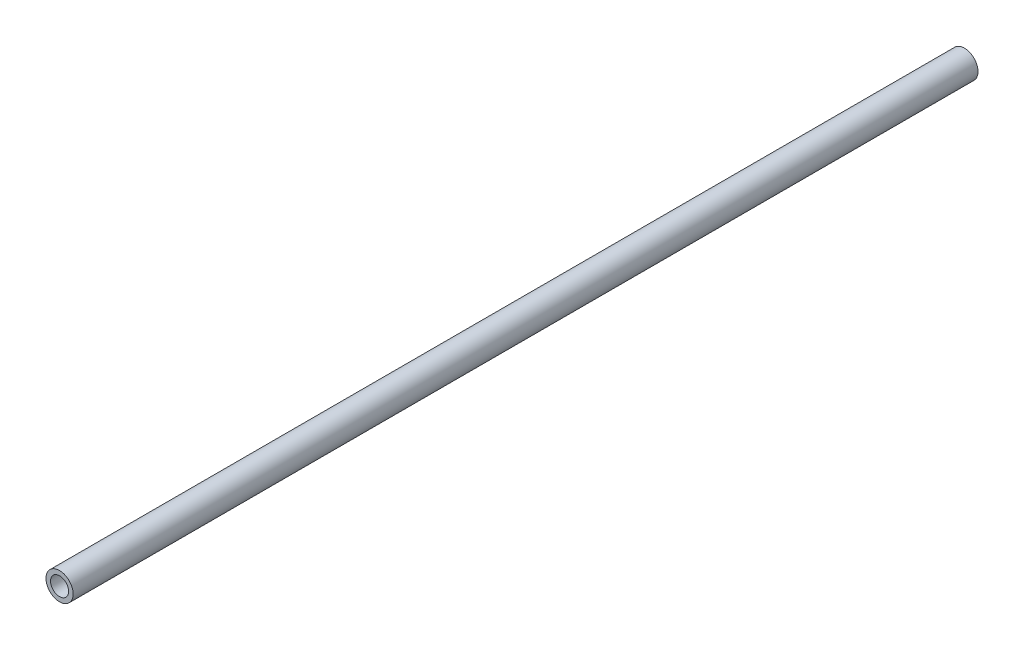
ISO-10303-21;
HEADER;
FILE_DESCRIPTION(('STEP AP214'),'2;1');
FILE_NAME('part.step','',(''),(''),'','','');
FILE_SCHEMA(('AUTOMOTIVE_DESIGN { 1 0 10303 214 1 1 1 1 }'));
ENDSEC;
DATA;
#1=APPLICATION_CONTEXT('core data for automotive mechanical design processes');
#2=APPLICATION_PROTOCOL_DEFINITION('international standard','automotive_design',2000,#1);
#3=PRODUCT_CONTEXT('',#1,'mechanical');
#4=PRODUCT('Part','Part','',(#3));
#5=PRODUCT_RELATED_PRODUCT_CATEGORY('part','',(#4));
#6=PRODUCT_DEFINITION_FORMATION('','',#4);
#7=PRODUCT_DEFINITION_CONTEXT('part definition',#1,'design');
#8=PRODUCT_DEFINITION('design','',#6,#7);
#9=PRODUCT_DEFINITION_SHAPE('','',#8);
#10=(LENGTH_UNIT() NAMED_UNIT(*) SI_UNIT(.MILLI.,.METRE.));
#11=(NAMED_UNIT(*) PLANE_ANGLE_UNIT() SI_UNIT($,.RADIAN.));
#12=(NAMED_UNIT(*) SI_UNIT($,.STERADIAN.) SOLID_ANGLE_UNIT());
#13=UNCERTAINTY_MEASURE_WITH_UNIT(LENGTH_MEASURE(1.E-05),#10,'distance_accuracy_value','');
#14=(GEOMETRIC_REPRESENTATION_CONTEXT(3) GLOBAL_UNCERTAINTY_ASSIGNED_CONTEXT((#13)) GLOBAL_UNIT_ASSIGNED_CONTEXT((#10,
#11,#12)) REPRESENTATION_CONTEXT('',''));
#15=CARTESIAN_POINT('',(0.,0.,0.));
#16=DIRECTION('',(0.,0.,1.));
#17=DIRECTION('',(1.,0.,0.));
#18=AXIS2_PLACEMENT_3D('',#15,#16,#17);
#19=CARTESIAN_POINT('',(0.,0.,200.));
#20=DIRECTION('',(0.,0.,1.));
#21=DIRECTION('',(1.,0.,0.));
#22=AXIS2_PLACEMENT_3D('',#19,#20,#21);
#23=PLANE('',#22);
#24=CARTESIAN_POINT('',(0.,0.,200.));
#25=DIRECTION('',(0.,0.,1.));
#26=DIRECTION('',(1.,0.,0.));
#27=AXIS2_PLACEMENT_3D('',#24,#25,#26);
#28=CIRCLE('',#27,3.);
#29=CARTESIAN_POINT('',(3.,0.,200.));
#30=VERTEX_POINT('',#29);
#31=EDGE_CURVE('E10',#30,#30,#28,.T.);
#32=ORIENTED_EDGE('',*,*,#31,.T.);
#33=EDGE_LOOP('',(#32));
#34=FACE_BOUND('',#33,.T.);
#35=CARTESIAN_POINT('',(0.,0.,200.));
#36=DIRECTION('',(0.,0.,1.));
#37=DIRECTION('',(1.,0.,0.));
#38=AXIS2_PLACEMENT_3D('',#35,#36,#37);
#39=CIRCLE('',#38,2.);
#40=CARTESIAN_POINT('',(2.,0.,200.));
#41=VERTEX_POINT('',#40);
#42=EDGE_CURVE('E42',#41,#41,#39,.T.);
#43=ORIENTED_EDGE('',*,*,#42,.F.);
#44=EDGE_LOOP('',(#43));
#45=FACE_BOUND('',#44,.T.);
#46=ADVANCED_FACE('F31',(#34,#45),#23,.T.);
#47=CARTESIAN_POINT('',(0.,0.,0.));
#48=DIRECTION('',(0.,0.,1.));
#49=DIRECTION('',(1.,0.,0.));
#50=AXIS2_PLACEMENT_3D('',#47,#48,#49);
#51=PLANE('',#50);
#52=CARTESIAN_POINT('',(0.,0.,0.));
#53=DIRECTION('',(0.,0.,1.));
#54=DIRECTION('',(1.,0.,0.));
#55=AXIS2_PLACEMENT_3D('',#52,#53,#54);
#56=CIRCLE('',#55,3.);
#57=CARTESIAN_POINT('',(3.,0.,0.));
#58=VERTEX_POINT('',#57);
#59=EDGE_CURVE('E35',#58,#58,#56,.T.);
#60=ORIENTED_EDGE('',*,*,#59,.F.);
#61=EDGE_LOOP('',(#60));
#62=FACE_BOUND('',#61,.T.);
#63=CARTESIAN_POINT('',(0.,0.,0.));
#64=DIRECTION('',(0.,0.,1.));
#65=DIRECTION('',(1.,0.,0.));
#66=AXIS2_PLACEMENT_3D('',#63,#64,#65);
#67=CIRCLE('',#66,2.);
#68=CARTESIAN_POINT('',(2.,0.,0.));
#69=VERTEX_POINT('',#68);
#70=EDGE_CURVE('E44',#69,#69,#67,.T.);
#71=ORIENTED_EDGE('',*,*,#70,.T.);
#72=EDGE_LOOP('',(#71));
#73=FACE_BOUND('',#72,.T.);
#74=ADVANCED_FACE('F54',(#62,#73),#51,.F.);
#75=CARTESIAN_POINT('',(0.,0.,200.));
#76=DIRECTION('',(0.,0.,-1.));
#77=DIRECTION('',(-1.,0.,0.));
#78=AXIS2_PLACEMENT_3D('',#75,#76,#77);
#79=CYLINDRICAL_SURFACE('',#78,3.);
#80=ORIENTED_EDGE('',*,*,#31,.F.);
#81=EDGE_LOOP('',(#80));
#82=FACE_BOUND('',#81,.T.);
#83=ORIENTED_EDGE('',*,*,#59,.T.);
#84=EDGE_LOOP('',(#83));
#85=FACE_BOUND('',#84,.T.);
#86=ADVANCED_FACE('F33',(#82,#85),#79,.T.);
#87=CARTESIAN_POINT('',(0.,0.,200.));
#88=DIRECTION('',(0.,0.,-1.));
#89=DIRECTION('',(-1.,0.,0.));
#90=AXIS2_PLACEMENT_3D('',#87,#88,#89);
#91=CYLINDRICAL_SURFACE('',#90,2.);
#92=ORIENTED_EDGE('',*,*,#42,.T.);
#93=EDGE_LOOP('',(#92));
#94=FACE_BOUND('',#93,.T.);
#95=ORIENTED_EDGE('',*,*,#70,.F.);
#96=EDGE_LOOP('',(#95));
#97=FACE_BOUND('',#96,.T.);
#98=ADVANCED_FACE('F50',(#94,#97),#91,.F.);
#99=CLOSED_SHELL('',(#46,#74,#86,#98));
#100=MANIFOLD_SOLID_BREP('B2',#99);
#101=ADVANCED_BREP_SHAPE_REPRESENTATION('',(#18,#100),#14);
#102=SHAPE_DEFINITION_REPRESENTATION(#9,#101);
ENDSEC;
END-ISO-10303-21;
